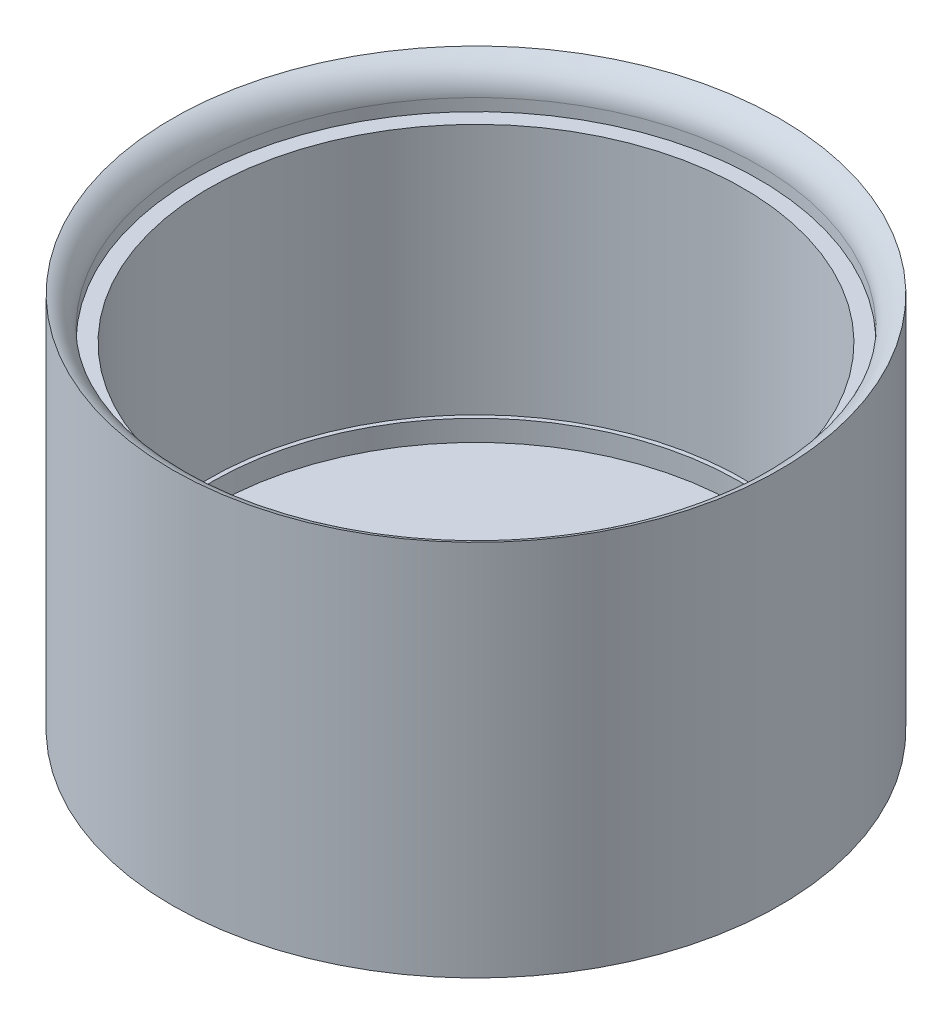
ISO-10303-21;
HEADER;
FILE_DESCRIPTION(('STEP AP214'),'2;1');
FILE_NAME('part.step','',(''),(''),'','','');
FILE_SCHEMA(('AUTOMOTIVE_DESIGN { 1 0 10303 214 1 1 1 1 }'));
ENDSEC;
DATA;
#1=APPLICATION_CONTEXT('core data for automotive mechanical design processes');
#2=APPLICATION_PROTOCOL_DEFINITION('international standard','automotive_design',2000,#1);
#3=PRODUCT_CONTEXT('',#1,'mechanical');
#4=PRODUCT('Part','Part','',(#3));
#5=PRODUCT_RELATED_PRODUCT_CATEGORY('part','',(#4));
#6=PRODUCT_DEFINITION_FORMATION('','',#4);
#7=PRODUCT_DEFINITION_CONTEXT('part definition',#1,'design');
#8=PRODUCT_DEFINITION('design','',#6,#7);
#9=PRODUCT_DEFINITION_SHAPE('','',#8);
#10=(LENGTH_UNIT() NAMED_UNIT(*) SI_UNIT(.MILLI.,.METRE.));
#11=(NAMED_UNIT(*) PLANE_ANGLE_UNIT() SI_UNIT($,.RADIAN.));
#12=(NAMED_UNIT(*) SI_UNIT($,.STERADIAN.) SOLID_ANGLE_UNIT());
#13=UNCERTAINTY_MEASURE_WITH_UNIT(LENGTH_MEASURE(1.E-05),#10,'distance_accuracy_value','');
#14=(GEOMETRIC_REPRESENTATION_CONTEXT(3) GLOBAL_UNCERTAINTY_ASSIGNED_CONTEXT((#13)) GLOBAL_UNIT_ASSIGNED_CONTEXT((#10,
#11,#12)) REPRESENTATION_CONTEXT('',''));
#15=CARTESIAN_POINT('',(0.,0.,0.));
#16=DIRECTION('',(0.,0.,1.));
#17=DIRECTION('',(1.,0.,0.));
#18=AXIS2_PLACEMENT_3D('',#15,#16,#17);
#19=CARTESIAN_POINT('',(0.,30.,0.));
#20=DIRECTION('',(0.,-1.,0.));
#21=DIRECTION('',(0.,0.,-1.));
#22=AXIS2_PLACEMENT_3D('',#19,#20,#21);
#23=CYLINDRICAL_SURFACE('',#22,25.5);
#24=CARTESIAN_POINT('',(0.,2.,0.));
#25=DIRECTION('',(0.,1.,0.));
#26=DIRECTION('',(0.,0.,1.));
#27=AXIS2_PLACEMENT_3D('',#24,#25,#26);
#28=CIRCLE('',#27,25.5);
#29=CARTESIAN_POINT('',(0.,2.,25.5));
#30=VERTEX_POINT('',#29);
#31=EDGE_CURVE('E10',#30,#30,#28,.T.);
#32=ORIENTED_EDGE('',*,*,#31,.F.);
#33=EDGE_LOOP('',(#32));
#34=FACE_BOUND('',#33,.T.);
#35=CARTESIAN_POINT('',(0.,26.,0.));
#36=DIRECTION('',(0.,1.,0.));
#37=DIRECTION('',(0.,0.,1.));
#38=AXIS2_PLACEMENT_3D('',#35,#36,#37);
#39=CIRCLE('',#38,25.5);
#40=CARTESIAN_POINT('',(0.,26.,25.5));
#41=VERTEX_POINT('',#40);
#42=EDGE_CURVE('E55',#41,#41,#39,.T.);
#43=ORIENTED_EDGE('',*,*,#42,.T.);
#44=EDGE_LOOP('',(#43));
#45=FACE_BOUND('',#44,.T.);
#46=ADVANCED_FACE('F35',(#34,#45),#23,.F.);
#47=CARTESIAN_POINT('',(0.,30.,0.));
#48=DIRECTION('',(0.,-1.,0.));
#49=DIRECTION('',(0.,0.,-1.));
#50=AXIS2_PLACEMENT_3D('',#47,#48,#49);
#51=CYLINDRICAL_SURFACE('',#50,29.);
#52=CARTESIAN_POINT('',(0.,30.,0.));
#53=DIRECTION('',(0.,1.,0.));
#54=DIRECTION('',(0.,0.,1.));
#55=AXIS2_PLACEMENT_3D('',#52,#53,#54);
#56=CIRCLE('',#55,29.);
#57=CARTESIAN_POINT('',(0.,30.,29.));
#58=VERTEX_POINT('',#57);
#59=EDGE_CURVE('E46',#58,#58,#56,.T.);
#60=ORIENTED_EDGE('',*,*,#59,.F.);
#61=EDGE_LOOP('',(#60));
#62=FACE_BOUND('',#61,.T.);
#63=CARTESIAN_POINT('',(0.,-6.,0.));
#64=DIRECTION('',(0.,-1.,0.));
#65=DIRECTION('',(0.,0.,-1.));
#66=AXIS2_PLACEMENT_3D('',#63,#64,#65);
#67=CIRCLE('',#66,29.);
#68=CARTESIAN_POINT('',(0.,-6.,-29.));
#69=VERTEX_POINT('',#68);
#70=EDGE_CURVE('E58',#69,#69,#67,.T.);
#71=ORIENTED_EDGE('',*,*,#70,.F.);
#72=EDGE_LOOP('',(#71));
#73=FACE_BOUND('',#72,.T.);
#74=ADVANCED_FACE('F91',(#62,#73),#51,.T.);
#75=CARTESIAN_POINT('',(0.,26.,0.));
#76=DIRECTION('',(0.,1.,0.));
#77=DIRECTION('',(0.,0.,1.));
#78=AXIS2_PLACEMENT_3D('',#75,#76,#77);
#79=CYLINDRICAL_SURFACE('',#78,26.9839082506886);
#80=CARTESIAN_POINT('',(0.,27.1659349770644,0.));
#81=DIRECTION('',(0.,1.,0.));
#82=DIRECTION('',(0.,0.,1.));
#83=AXIS2_PLACEMENT_3D('',#80,#81,#82);
#84=CIRCLE('',#83,26.9839082506886);
#85=CARTESIAN_POINT('',(0.,27.1659349770644,26.9839082506886));
#86=VERTEX_POINT('',#85);
#87=EDGE_CURVE('E42',#86,#86,#84,.T.);
#88=ORIENTED_EDGE('',*,*,#87,.T.);
#89=EDGE_LOOP('',(#88));
#90=FACE_BOUND('',#89,.T.);
#91=CARTESIAN_POINT('',(0.,26.,0.));
#92=DIRECTION('',(0.,1.,0.));
#93=DIRECTION('',(0.,0.,1.));
#94=AXIS2_PLACEMENT_3D('',#91,#92,#93);
#95=CIRCLE('',#94,26.9839082506886);
#96=CARTESIAN_POINT('',(0.,26.,26.9839082506886));
#97=VERTEX_POINT('',#96);
#98=EDGE_CURVE('E50',#97,#97,#95,.T.);
#99=ORIENTED_EDGE('',*,*,#98,.F.);
#100=EDGE_LOOP('',(#99));
#101=FACE_BOUND('',#100,.T.);
#102=ADVANCED_FACE('F97',(#90,#101),#79,.F.);
#103=CARTESIAN_POINT('',(0.,26.,0.));
#104=DIRECTION('',(0.,1.,0.));
#105=DIRECTION('',(0.,0.,1.));
#106=AXIS2_PLACEMENT_3D('',#103,#104,#105);
#107=PLANE('',#106);
#108=ORIENTED_EDGE('',*,*,#42,.F.);
#109=EDGE_LOOP('',(#108));
#110=FACE_BOUND('',#109,.T.);
#111=ORIENTED_EDGE('',*,*,#98,.T.);
#112=EDGE_LOOP('',(#111));
#113=FACE_BOUND('',#112,.T.);
#114=ADVANCED_FACE('F103',(#110,#113),#107,.T.);
#115=CARTESIAN_POINT('',(0.,27.1659349770644,0.));
#116=DIRECTION('',(0.,1.,0.));
#117=DIRECTION('',(0.,0.,1.));
#118=AXIS2_PLACEMENT_3D('',#115,#116,#117);
#119=TOROIDAL_SURFACE('',#118,29.9839082506886,3.);
#120=ORIENTED_EDGE('',*,*,#59,.T.);
#121=EDGE_LOOP('',(#120));
#122=FACE_BOUND('',#121,.T.);
#123=ORIENTED_EDGE('',*,*,#87,.F.);
#124=EDGE_LOOP('',(#123));
#125=FACE_BOUND('',#124,.T.);
#126=ADVANCED_FACE('F37',(#122,#125),#119,.T.);
#127=CARTESIAN_POINT('',(0.,-6.,0.));
#128=DIRECTION('',(0.,-1.,0.));
#129=DIRECTION('',(0.,0.,-1.));
#130=AXIS2_PLACEMENT_3D('',#127,#128,#129);
#131=PLANE('',#130);
#132=ORIENTED_EDGE('',*,*,#70,.T.);
#133=EDGE_LOOP('',(#132));
#134=FACE_BOUND('',#133,.T.);
#135=ADVANCED_FACE('F79',(#134),#131,.T.);
#136=CARTESIAN_POINT('',(0.,2.,0.));
#137=DIRECTION('',(0.,1.,0.));
#138=DIRECTION('',(0.,0.,1.));
#139=AXIS2_PLACEMENT_3D('',#136,#137,#138);
#140=PLANE('',#139);
#141=ORIENTED_EDGE('',*,*,#31,.T.);
#142=EDGE_LOOP('',(#141));
#143=FACE_BOUND('',#142,.T.);
#144=CARTESIAN_POINT('',(0.,2.,0.));
#145=DIRECTION('',(0.,1.,0.));
#146=DIRECTION('',(0.,0.,1.));
#147=AXIS2_PLACEMENT_3D('',#144,#145,#146);
#148=CIRCLE('',#147,25.1);
#149=CARTESIAN_POINT('',(0.,2.,25.1));
#150=VERTEX_POINT('',#149);
#151=EDGE_CURVE('E65',#150,#150,#148,.T.);
#152=ORIENTED_EDGE('',*,*,#151,.F.);
#153=EDGE_LOOP('',(#152));
#154=FACE_BOUND('',#153,.T.);
#155=ADVANCED_FACE('F77',(#143,#154),#140,.T.);
#156=CARTESIAN_POINT('',(0.,2.,0.));
#157=DIRECTION('',(0.,-1.,0.));
#158=DIRECTION('',(0.,0.,-1.));
#159=AXIS2_PLACEMENT_3D('',#156,#157,#158);
#160=CYLINDRICAL_SURFACE('',#159,25.1);
#161=ORIENTED_EDGE('',*,*,#151,.T.);
#162=EDGE_LOOP('',(#161));
#163=FACE_BOUND('',#162,.T.);
#164=CARTESIAN_POINT('',(0.,0.,0.));
#165=DIRECTION('',(0.,1.,0.));
#166=DIRECTION('',(0.,0.,1.));
#167=AXIS2_PLACEMENT_3D('',#164,#165,#166);
#168=CIRCLE('',#167,25.1);
#169=CARTESIAN_POINT('',(0.,0.,25.1));
#170=VERTEX_POINT('',#169);
#171=EDGE_CURVE('E68',#170,#170,#168,.T.);
#172=ORIENTED_EDGE('',*,*,#171,.F.);
#173=EDGE_LOOP('',(#172));
#174=FACE_BOUND('',#173,.T.);
#175=ADVANCED_FACE('F74',(#163,#174),#160,.F.);
#176=CARTESIAN_POINT('',(0.,-4.3,0.));
#177=DIRECTION('',(0.,1.,0.));
#178=DIRECTION('',(0.,0.,1.));
#179=AXIS2_PLACEMENT_3D('',#176,#177,#178);
#180=PLANE('',#179);
#181=CARTESIAN_POINT('',(0.,-4.3,0.));
#182=DIRECTION('',(0.,1.,0.));
#183=DIRECTION('',(0.,0.,1.));
#184=AXIS2_PLACEMENT_3D('',#181,#182,#183);
#185=CIRCLE('',#184,4.);
#186=CARTESIAN_POINT('',(0.,-4.3,4.));
#187=VERTEX_POINT('',#186);
#188=EDGE_CURVE('E61',#187,#187,#185,.T.);
#189=ORIENTED_EDGE('',*,*,#188,.T.);
#190=EDGE_LOOP('',(#189));
#191=FACE_BOUND('',#190,.T.);
#192=ADVANCED_FACE('F85',(#191),#180,.T.);
#193=CARTESIAN_POINT('',(0.,-4.3,0.));
#194=DIRECTION('',(0.,1.,0.));
#195=DIRECTION('',(0.,0.,1.));
#196=AXIS2_PLACEMENT_3D('',#193,#194,#195);
#197=CYLINDRICAL_SURFACE('',#196,4.);
#198=CARTESIAN_POINT('',(0.,0.,0.));
#199=DIRECTION('',(0.,1.,0.));
#200=DIRECTION('',(0.,0.,1.));
#201=AXIS2_PLACEMENT_3D('',#198,#199,#200);
#202=CIRCLE('',#201,4.);
#203=CARTESIAN_POINT('',(0.,0.,4.));
#204=VERTEX_POINT('',#203);
#205=EDGE_CURVE('E62',#204,#204,#202,.T.);
#206=CARTESIAN_POINT('',(0.,-4.3,4.));
#207=CARTESIAN_POINT('',(0.,-4.25520833333333,4.));
#208=CARTESIAN_POINT('',(0.,-4.21041666666667,4.));
#209=CARTESIAN_POINT('',(0.,-4.12083333333333,4.));
#210=CARTESIAN_POINT('',(0.,-4.07604166666667,4.));
#211=CARTESIAN_POINT('',(0.,-3.98645833333333,4.));
#212=CARTESIAN_POINT('',(0.,-3.94166666666667,4.));
#213=CARTESIAN_POINT('',(0.,-3.85208333333333,4.));
#214=CARTESIAN_POINT('',(0.,-3.80729166666667,4.));
#215=CARTESIAN_POINT('',(0.,-3.71770833333333,4.));
#216=CARTESIAN_POINT('',(0.,-3.67291666666667,4.));
#217=CARTESIAN_POINT('',(0.,-3.58333333333333,4.));
#218=CARTESIAN_POINT('',(0.,-3.53854166666667,4.));
#219=CARTESIAN_POINT('',(0.,-3.44895833333333,4.));
#220=CARTESIAN_POINT('',(0.,-3.40416666666667,4.));
#221=CARTESIAN_POINT('',(0.,-3.31458333333333,4.));
#222=CARTESIAN_POINT('',(0.,-3.26979166666667,4.));
#223=CARTESIAN_POINT('',(0.,-3.18020833333333,4.));
#224=CARTESIAN_POINT('',(0.,-3.13541666666667,4.));
#225=CARTESIAN_POINT('',(0.,-3.04583333333333,4.));
#226=CARTESIAN_POINT('',(0.,-3.00104166666667,4.));
#227=CARTESIAN_POINT('',(0.,-2.91145833333333,4.));
#228=CARTESIAN_POINT('',(0.,-2.86666666666667,4.));
#229=CARTESIAN_POINT('',(0.,-2.77708333333333,4.));
#230=CARTESIAN_POINT('',(0.,-2.73229166666667,4.));
#231=CARTESIAN_POINT('',(0.,-2.64270833333333,4.));
#232=CARTESIAN_POINT('',(0.,-2.59791666666667,4.));
#233=CARTESIAN_POINT('',(0.,-2.50833333333333,4.));
#234=CARTESIAN_POINT('',(0.,-2.46354166666667,4.));
#235=CARTESIAN_POINT('',(0.,-2.37395833333333,4.));
#236=CARTESIAN_POINT('',(0.,-2.32916666666667,4.));
#237=CARTESIAN_POINT('',(0.,-2.23958333333333,4.));
#238=CARTESIAN_POINT('',(0.,-2.19479166666667,4.));
#239=CARTESIAN_POINT('',(0.,-2.10520833333333,4.));
#240=CARTESIAN_POINT('',(0.,-2.06041666666667,4.));
#241=CARTESIAN_POINT('',(0.,-1.97083333333333,4.));
#242=CARTESIAN_POINT('',(0.,-1.92604166666667,4.));
#243=CARTESIAN_POINT('',(0.,-1.83645833333333,4.));
#244=CARTESIAN_POINT('',(0.,-1.79166666666667,4.));
#245=CARTESIAN_POINT('',(0.,-1.70208333333333,4.));
#246=CARTESIAN_POINT('',(0.,-1.65729166666667,4.));
#247=CARTESIAN_POINT('',(0.,-1.56770833333333,4.));
#248=CARTESIAN_POINT('',(0.,-1.52291666666667,4.));
#249=CARTESIAN_POINT('',(0.,-1.43333333333333,4.));
#250=CARTESIAN_POINT('',(0.,-1.38854166666667,4.));
#251=CARTESIAN_POINT('',(0.,-1.29895833333333,4.));
#252=CARTESIAN_POINT('',(0.,-1.25416666666667,4.));
#253=CARTESIAN_POINT('',(0.,-1.16458333333333,4.));
#254=CARTESIAN_POINT('',(0.,-1.11979166666667,4.));
#255=CARTESIAN_POINT('',(0.,-1.03020833333333,4.));
#256=CARTESIAN_POINT('',(0.,-0.985416666666668,4.));
#257=CARTESIAN_POINT('',(0.,-0.895833333333334,4.));
#258=CARTESIAN_POINT('',(0.,-0.851041666666668,4.));
#259=CARTESIAN_POINT('',(0.,-0.761458333333334,4.));
#260=CARTESIAN_POINT('',(0.,-0.716666666666668,4.));
#261=CARTESIAN_POINT('',(0.,-0.627083333333334,4.));
#262=CARTESIAN_POINT('',(0.,-0.582291666666667,4.));
#263=CARTESIAN_POINT('',(0.,-0.492708333333334,4.));
#264=CARTESIAN_POINT('',(0.,-0.447916666666667,4.));
#265=CARTESIAN_POINT('',(0.,-0.358333333333334,4.));
#266=CARTESIAN_POINT('',(0.,-0.313541666666667,4.));
#267=CARTESIAN_POINT('',(0.,-0.223958333333334,4.));
#268=CARTESIAN_POINT('',(0.,-0.179166666666667,4.));
#269=CARTESIAN_POINT('',(0.,-0.0895833333333342,4.));
#270=CARTESIAN_POINT('',(0.,-0.0447916666666675,4.));
#271=CARTESIAN_POINT('',(0.,0.,4.));
#272=B_SPLINE_CURVE_WITH_KNOTS('',3,(#206,#207,#208,#209,#210,#211,#212,#213,#214,#215,#216,
#217,#218,#219,#220,#221,#222,#223,#224,#225,#226,#227,#228,#229,#230,#231,#232,#233,#234,#235,
#236,#237,#238,#239,#240,#241,#242,#243,#244,#245,#246,#247,#248,#249,#250,#251,#252,#253,#254,
#255,#256,#257,#258,#259,#260,#261,#262,#263,#264,#265,#266,#267,#268,#269,#270,#271),
.UNSPECIFIED.,.F.,.F.,(4,2,2,2,2,2,2,2,2,2,2,2,2,2,2,2,2,2,2,2,2,2,2,2,2,2,2,2,2,2,2,2,4),(0.,
0.134375,0.26875,0.403124999999999,0.537499999999999,0.671874999999999,0.80625,0.940625,1.075,
1.209375,1.34375,1.478125,1.6125,1.746875,1.88125,2.015625,2.15,2.284375,2.41875,2.553125,
2.6875,2.821875,2.95625,3.090625,3.225,3.359375,3.49375,3.628125,3.7625,3.896875,4.03125,
4.165625,4.3),.UNSPECIFIED.);
#273=EDGE_CURVE('BSEAM109',#187,#204,#272,.T.);
#274=ORIENTED_EDGE('',*,*,#188,.F.);
#275=ORIENTED_EDGE('',*,*,#205,.T.);
#276=ORIENTED_EDGE('',*,*,#273,.T.);
#277=ORIENTED_EDGE('',*,*,#273,.F.);
#278=EDGE_LOOP('',(#274,#276,#275,#277));
#279=FACE_BOUND('',#278,.T.);
#280=ADVANCED_FACE('F109',(#279),#197,.F.);
#281=CARTESIAN_POINT('',(0.,0.,0.));
#282=DIRECTION('',(0.,-1.,0.));
#283=DIRECTION('',(0.,0.,-1.));
#284=AXIS2_PLACEMENT_3D('',#281,#282,#283);
#285=PLANE('',#284);
#286=ORIENTED_EDGE('',*,*,#205,.F.);
#287=EDGE_LOOP('',(#286));
#288=FACE_BOUND('',#287,.T.);
#289=ORIENTED_EDGE('',*,*,#171,.T.);
#290=EDGE_LOOP('',(#289));
#291=FACE_BOUND('',#290,.T.);
#292=ADVANCED_FACE('F107',(#288,#291),#285,.F.);
#293=CLOSED_SHELL('',(#46,#74,#102,#114,#126,#135,#155,#175,#192,#280,#292));
#294=MANIFOLD_SOLID_BREP('B2',#293);
#295=ADVANCED_BREP_SHAPE_REPRESENTATION('',(#18,#294),#14);
#296=SHAPE_DEFINITION_REPRESENTATION(#9,#295);
ENDSEC;
END-ISO-10303-21;
